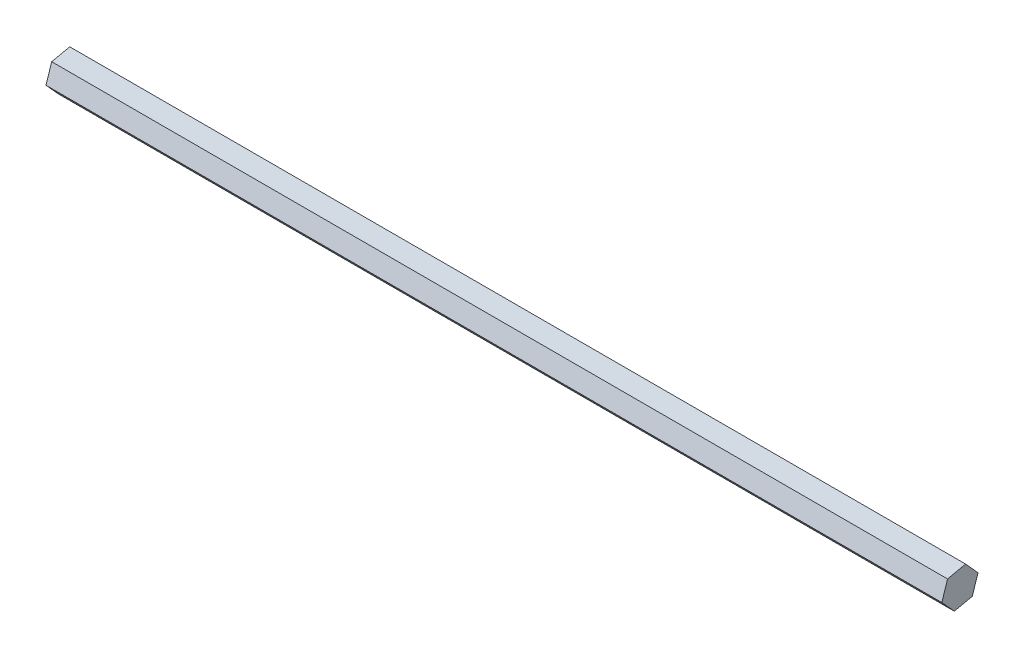
ISO-10303-21;
HEADER;
FILE_DESCRIPTION(('STEP AP214'),'2;1');
FILE_NAME('part.step','',(''),(''),'','','');
FILE_SCHEMA(('AUTOMOTIVE_DESIGN { 1 0 10303 214 1 1 1 1 }'));
ENDSEC;
DATA;
#1=APPLICATION_CONTEXT('core data for automotive mechanical design processes');
#2=APPLICATION_PROTOCOL_DEFINITION('international standard','automotive_design',2000,#1);
#3=PRODUCT_CONTEXT('',#1,'mechanical');
#4=PRODUCT('Part','Part','',(#3));
#5=PRODUCT_RELATED_PRODUCT_CATEGORY('part','',(#4));
#6=PRODUCT_DEFINITION_FORMATION('','',#4);
#7=PRODUCT_DEFINITION_CONTEXT('part definition',#1,'design');
#8=PRODUCT_DEFINITION('design','',#6,#7);
#9=PRODUCT_DEFINITION_SHAPE('','',#8);
#10=(LENGTH_UNIT() NAMED_UNIT(*) SI_UNIT(.MILLI.,.METRE.));
#11=(NAMED_UNIT(*) PLANE_ANGLE_UNIT() SI_UNIT($,.RADIAN.));
#12=(NAMED_UNIT(*) SI_UNIT($,.STERADIAN.) SOLID_ANGLE_UNIT());
#13=UNCERTAINTY_MEASURE_WITH_UNIT(LENGTH_MEASURE(1.E-05),#10,'distance_accuracy_value','');
#14=(GEOMETRIC_REPRESENTATION_CONTEXT(3) GLOBAL_UNCERTAINTY_ASSIGNED_CONTEXT((#13)) GLOBAL_UNIT_ASSIGNED_CONTEXT((#10,
#11,#12)) REPRESENTATION_CONTEXT('',''));
#15=CARTESIAN_POINT('',(0.,0.,0.));
#16=DIRECTION('',(0.,0.,1.));
#17=DIRECTION('',(1.,0.,0.));
#18=AXIS2_PLACEMENT_3D('',#15,#16,#17);
#19=CARTESIAN_POINT('',(-177.8,-15.918659827059,32.70007928676));
#20=DIRECTION('',(0.,-0.670294738560156,0.742094982774154));
#21=DIRECTION('',(0.,-0.742094982774155,-0.670294738560156));
#22=AXIS2_PLACEMENT_3D('',#19,#20,#21);
#23=PLANE('',#22);
#24=DIRECTION('',(1.,0.,0.));
#25=VECTOR('',#24,1.);
#26=CARTESIAN_POINT('',(-177.8,-21.3599588005344,27.78524472041));
#27=LINE('',#26,#25);
#28=CARTESIAN_POINT('',(-177.8,-21.3599588005344,27.78524472041));
#29=VERTEX_POINT('',#28);
#30=CARTESIAN_POINT('',(177.8,-21.3599588005344,27.78524472041));
#31=VERTEX_POINT('',#30);
#32=EDGE_CURVE('E35',#29,#31,#27,.T.);
#33=ORIENTED_EDGE('',*,*,#32,.T.);
#34=DIRECTION('',(0.,-0.742094982774155,-0.670294738560156));
#35=VECTOR('',#34,1.);
#36=CARTESIAN_POINT('',(177.8,-15.918659827059,32.70007928676));
#37=LINE('',#36,#35);
#38=CARTESIAN_POINT('',(177.8,-15.918659827059,32.70007928676));
#39=VERTEX_POINT('',#38);
#40=EDGE_CURVE('E84',#39,#31,#37,.T.);
#41=ORIENTED_EDGE('',*,*,#40,.F.);
#42=DIRECTION('',(1.,0.,0.));
#43=VECTOR('',#42,1.);
#44=CARTESIAN_POINT('',(-177.8,-15.918659827059,32.70007928676));
#45=LINE('',#44,#43);
#46=CARTESIAN_POINT('',(-177.8,-15.918659827059,32.70007928676));
#47=VERTEX_POINT('',#46);
#48=EDGE_CURVE('E11',#47,#39,#45,.T.);
#49=ORIENTED_EDGE('',*,*,#48,.F.);
#50=DIRECTION('',(0.,-0.742094982774155,-0.670294738560156));
#51=VECTOR('',#50,1.);
#52=CARTESIAN_POINT('',(-177.8,-15.918659827059,32.70007928676));
#53=LINE('',#52,#51);
#54=EDGE_CURVE('E85',#47,#29,#53,.T.);
#55=ORIENTED_EDGE('',*,*,#54,.T.);
#56=EDGE_LOOP('',(#33,#41,#49,#55));
#57=FACE_BOUND('',#56,.T.);
#58=ADVANCED_FACE('F32',(#57),#23,.T.);
#59=CARTESIAN_POINT('',(-177.8,-8.94163875046433,30.4451934293191));
#60=DIRECTION('',(0.,0.307525737823315,0.951539763003221));
#61=DIRECTION('',(0.,-0.951539763003221,0.307525737823315));
#62=AXIS2_PLACEMENT_3D('',#59,#60,#61);
#63=PLANE('',#62);
#64=ORIENTED_EDGE('',*,*,#48,.T.);
#65=DIRECTION('',(0.,-0.951539763003221,0.307525737823315));
#66=VECTOR('',#65,1.);
#67=CARTESIAN_POINT('',(177.8,-8.94163875046433,30.4451934293191));
#68=LINE('',#67,#66);
#69=CARTESIAN_POINT('',(177.8,-8.94163875046433,30.4451934293191));
#70=VERTEX_POINT('',#69);
#71=EDGE_CURVE('E102',#70,#39,#68,.T.);
#72=ORIENTED_EDGE('',*,*,#71,.F.);
#73=DIRECTION('',(1.,0.,0.));
#74=VECTOR('',#73,1.);
#75=CARTESIAN_POINT('',(-177.8,-8.94163875046433,30.4451934293191));
#76=LINE('',#75,#74);
#77=CARTESIAN_POINT('',(-177.8,-8.94163875046433,30.4451934293191));
#78=VERTEX_POINT('',#77);
#79=EDGE_CURVE('E40',#78,#70,#76,.T.);
#80=ORIENTED_EDGE('',*,*,#79,.F.);
#81=DIRECTION('',(0.,-0.951539763003221,0.307525737823315));
#82=VECTOR('',#81,1.);
#83=CARTESIAN_POINT('',(-177.8,-8.94163875046433,30.4451934293191));
#84=LINE('',#83,#82);
#85=EDGE_CURVE('E90',#78,#47,#84,.T.);
#86=ORIENTED_EDGE('',*,*,#85,.T.);
#87=EDGE_LOOP('',(#64,#72,#80,#86));
#88=FACE_BOUND('',#87,.T.);
#89=ADVANCED_FACE('F142',(#88),#63,.T.);
#90=CARTESIAN_POINT('',(-177.8,-7.40591664734504,23.2754730055282));
#91=DIRECTION('',(0.,0.977820476383471,0.209444780229066));
#92=DIRECTION('',(0.,-0.209444780229066,0.977820476383471));
#93=AXIS2_PLACEMENT_3D('',#90,#91,#92);
#94=PLANE('',#93);
#95=ORIENTED_EDGE('',*,*,#79,.T.);
#96=DIRECTION('',(0.,-0.209444780229066,0.977820476383471));
#97=VECTOR('',#96,1.);
#98=CARTESIAN_POINT('',(177.8,-7.40591664734504,23.2754730055282));
#99=LINE('',#98,#97);
#100=CARTESIAN_POINT('',(177.8,-7.40591664734504,23.2754730055282));
#101=VERTEX_POINT('',#100);
#102=EDGE_CURVE('E109',#101,#70,#99,.T.);
#103=ORIENTED_EDGE('',*,*,#102,.F.);
#104=DIRECTION('',(1.,0.,0.));
#105=VECTOR('',#104,1.);
#106=CARTESIAN_POINT('',(-177.8,-7.40591664734504,23.2754730055282));
#107=LINE('',#106,#105);
#108=CARTESIAN_POINT('',(-177.8,-7.40591664734504,23.2754730055282));
#109=VERTEX_POINT('',#108);
#110=EDGE_CURVE('E125',#109,#101,#107,.T.);
#111=ORIENTED_EDGE('',*,*,#110,.F.);
#112=DIRECTION('',(0.,-0.209444780229066,0.977820476383471));
#113=VECTOR('',#112,1.);
#114=CARTESIAN_POINT('',(-177.8,-7.40591664734504,23.2754730055282));
#115=LINE('',#114,#113);
#116=EDGE_CURVE('E121',#109,#78,#115,.T.);
#117=ORIENTED_EDGE('',*,*,#116,.T.);
#118=EDGE_LOOP('',(#95,#103,#111,#117));
#119=FACE_BOUND('',#118,.T.);
#120=ADVANCED_FACE('F138',(#119),#94,.T.);
#121=CARTESIAN_POINT('',(-177.8,-12.8472156208204,18.3606384391782));
#122=DIRECTION('',(0.,0.670294738560156,-0.742094982774154));
#123=DIRECTION('',(0.,0.742094982774155,0.670294738560156));
#124=AXIS2_PLACEMENT_3D('',#121,#122,#123);
#125=PLANE('',#124);
#126=ORIENTED_EDGE('',*,*,#110,.T.);
#127=DIRECTION('',(0.,0.742094982774155,0.670294738560156));
#128=VECTOR('',#127,1.);
#129=CARTESIAN_POINT('',(177.8,-12.8472156208204,18.3606384391782));
#130=LINE('',#129,#128);
#131=CARTESIAN_POINT('',(177.8,-12.8472156208204,18.3606384391782));
#132=VERTEX_POINT('',#131);
#133=EDGE_CURVE('E106',#132,#101,#130,.T.);
#134=ORIENTED_EDGE('',*,*,#133,.F.);
#135=DIRECTION('',(1.,0.,0.));
#136=VECTOR('',#135,1.);
#137=CARTESIAN_POINT('',(-177.8,-12.8472156208204,18.3606384391782));
#138=LINE('',#137,#136);
#139=CARTESIAN_POINT('',(-177.8,-12.8472156208204,18.3606384391782));
#140=VERTEX_POINT('',#139);
#141=EDGE_CURVE('E127',#140,#132,#138,.T.);
#142=ORIENTED_EDGE('',*,*,#141,.F.);
#143=DIRECTION('',(0.,0.742094982774155,0.670294738560156));
#144=VECTOR('',#143,1.);
#145=CARTESIAN_POINT('',(-177.8,-12.8472156208204,18.3606384391782));
#146=LINE('',#145,#144);
#147=EDGE_CURVE('E118',#140,#109,#146,.T.);
#148=ORIENTED_EDGE('',*,*,#147,.T.);
#149=EDGE_LOOP('',(#126,#134,#142,#148));
#150=FACE_BOUND('',#149,.T.);
#151=ADVANCED_FACE('F135',(#150),#125,.T.);
#152=CARTESIAN_POINT('',(-177.8,-19.8242366974151,20.6155242966191));
#153=DIRECTION('',(0.,-0.307525737823315,-0.951539763003221));
#154=DIRECTION('',(0.,0.951539763003221,-0.307525737823315));
#155=AXIS2_PLACEMENT_3D('',#152,#153,#154);
#156=PLANE('',#155);
#157=ORIENTED_EDGE('',*,*,#141,.T.);
#158=DIRECTION('',(0.,0.951539763003221,-0.307525737823315));
#159=VECTOR('',#158,1.);
#160=CARTESIAN_POINT('',(177.8,-19.8242366974151,20.6155242966191));
#161=LINE('',#160,#159);
#162=CARTESIAN_POINT('',(177.8,-19.8242366974151,20.6155242966191));
#163=VERTEX_POINT('',#162);
#164=EDGE_CURVE('E97',#163,#132,#161,.T.);
#165=ORIENTED_EDGE('',*,*,#164,.F.);
#166=DIRECTION('',(1.,0.,0.));
#167=VECTOR('',#166,1.);
#168=CARTESIAN_POINT('',(-177.8,-19.8242366974151,20.6155242966191));
#169=LINE('',#168,#167);
#170=CARTESIAN_POINT('',(-177.8,-19.8242366974151,20.6155242966191));
#171=VERTEX_POINT('',#170);
#172=EDGE_CURVE('E89',#171,#163,#169,.T.);
#173=ORIENTED_EDGE('',*,*,#172,.F.);
#174=DIRECTION('',(0.,0.951539763003221,-0.307525737823315));
#175=VECTOR('',#174,1.);
#176=CARTESIAN_POINT('',(-177.8,-19.8242366974151,20.6155242966191));
#177=LINE('',#176,#175);
#178=EDGE_CURVE('E115',#171,#140,#177,.T.);
#179=ORIENTED_EDGE('',*,*,#178,.T.);
#180=EDGE_LOOP('',(#157,#165,#173,#179));
#181=FACE_BOUND('',#180,.T.);
#182=ADVANCED_FACE('F129',(#181),#156,.T.);
#183=CARTESIAN_POINT('',(-177.8,-21.3599588005344,27.78524472041));
#184=DIRECTION('',(0.,-0.977820476383471,-0.209444780229066));
#185=DIRECTION('',(0.,0.209444780229066,-0.977820476383471));
#186=AXIS2_PLACEMENT_3D('',#183,#184,#185);
#187=PLANE('',#186);
#188=ORIENTED_EDGE('',*,*,#172,.T.);
#189=DIRECTION('',(0.,0.209444780229065,-0.977820476383471));
#190=VECTOR('',#189,1.);
#191=CARTESIAN_POINT('',(177.8,-21.3599588005344,27.78524472041));
#192=LINE('',#191,#190);
#193=EDGE_CURVE('E92',#31,#163,#192,.T.);
#194=ORIENTED_EDGE('',*,*,#193,.F.);
#195=ORIENTED_EDGE('',*,*,#32,.F.);
#196=DIRECTION('',(0.,0.209444780229065,-0.977820476383471));
#197=VECTOR('',#196,1.);
#198=CARTESIAN_POINT('',(-177.8,-21.3599588005344,27.78524472041));
#199=LINE('',#198,#197);
#200=EDGE_CURVE('E113',#29,#171,#199,.T.);
#201=ORIENTED_EDGE('',*,*,#200,.T.);
#202=EDGE_LOOP('',(#188,#194,#195,#201));
#203=FACE_BOUND('',#202,.T.);
#204=ADVANCED_FACE('F93',(#203),#187,.T.);
#205=CARTESIAN_POINT('',(-177.8,0.,0.));
#206=DIRECTION('',(1.,0.,0.));
#207=DIRECTION('',(0.,0.,-1.));
#208=AXIS2_PLACEMENT_3D('',#205,#206,#207);
#209=PLANE('',#208);
#210=ORIENTED_EDGE('',*,*,#54,.F.);
#211=ORIENTED_EDGE('',*,*,#85,.F.);
#212=ORIENTED_EDGE('',*,*,#116,.F.);
#213=ORIENTED_EDGE('',*,*,#147,.F.);
#214=ORIENTED_EDGE('',*,*,#178,.F.);
#215=ORIENTED_EDGE('',*,*,#200,.F.);
#216=EDGE_LOOP('',(#210,#211,#212,#213,#214,#215));
#217=FACE_BOUND('',#216,.T.);
#218=ADVANCED_FACE('F141',(#217),#209,.F.);
#219=CARTESIAN_POINT('',(177.8,0.,0.));
#220=DIRECTION('',(1.,0.,0.));
#221=DIRECTION('',(0.,0.,-1.));
#222=AXIS2_PLACEMENT_3D('',#219,#220,#221);
#223=PLANE('',#222);
#224=ORIENTED_EDGE('',*,*,#40,.T.);
#225=ORIENTED_EDGE('',*,*,#193,.T.);
#226=ORIENTED_EDGE('',*,*,#164,.T.);
#227=ORIENTED_EDGE('',*,*,#133,.T.);
#228=ORIENTED_EDGE('',*,*,#102,.T.);
#229=ORIENTED_EDGE('',*,*,#71,.T.);
#230=EDGE_LOOP('',(#224,#225,#226,#227,#228,#229));
#231=FACE_BOUND('',#230,.T.);
#232=ADVANCED_FACE('F100',(#231),#223,.T.);
#233=CLOSED_SHELL('',(#58,#89,#120,#151,#182,#204,#218,#232));
#234=MANIFOLD_SOLID_BREP('B2',#233);
#235=ADVANCED_BREP_SHAPE_REPRESENTATION('',(#18,#234),#14);
#236=SHAPE_DEFINITION_REPRESENTATION(#9,#235);
ENDSEC;
END-ISO-10303-21;
